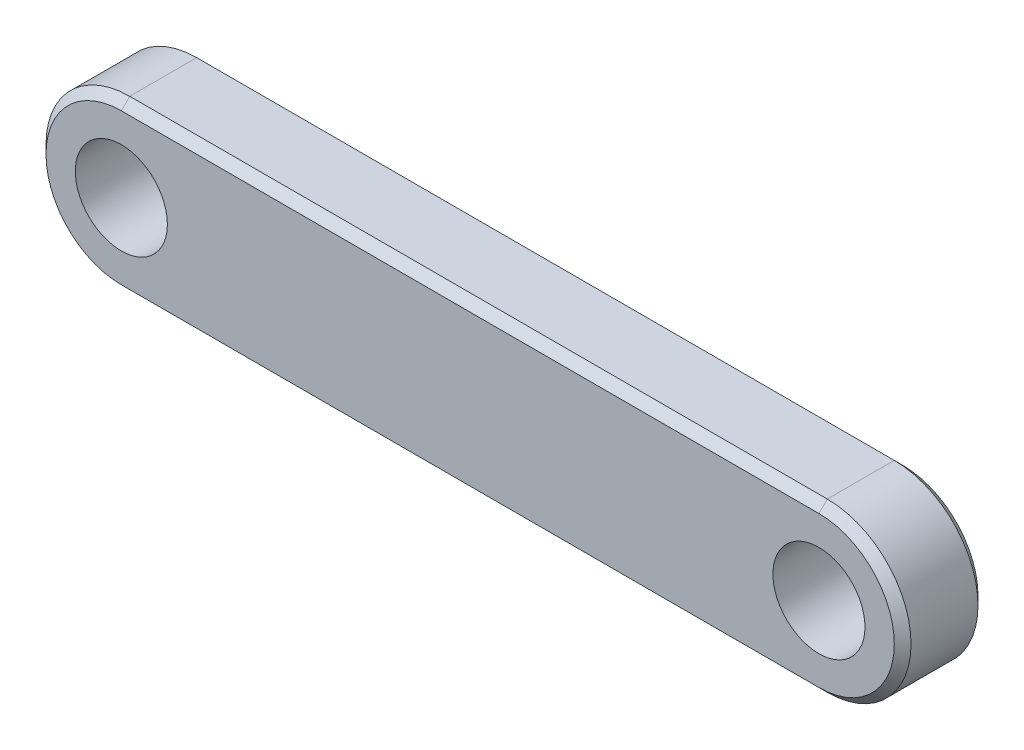
ISO-10303-21;
HEADER;
FILE_DESCRIPTION(('STEP AP214'),'2;1');
FILE_NAME('part.step','',(''),(''),'','','');
FILE_SCHEMA(('AUTOMOTIVE_DESIGN { 1 0 10303 214 1 1 1 1 }'));
ENDSEC;
DATA;
#1=APPLICATION_CONTEXT('core data for automotive mechanical design processes');
#2=APPLICATION_PROTOCOL_DEFINITION('international standard','automotive_design',2000,#1);
#3=PRODUCT_CONTEXT('',#1,'mechanical');
#4=PRODUCT('Part','Part','',(#3));
#5=PRODUCT_RELATED_PRODUCT_CATEGORY('part','',(#4));
#6=PRODUCT_DEFINITION_FORMATION('','',#4);
#7=PRODUCT_DEFINITION_CONTEXT('part definition',#1,'design');
#8=PRODUCT_DEFINITION('design','',#6,#7);
#9=PRODUCT_DEFINITION_SHAPE('','',#8);
#10=(LENGTH_UNIT() NAMED_UNIT(*) SI_UNIT(.MILLI.,.METRE.));
#11=(NAMED_UNIT(*) PLANE_ANGLE_UNIT() SI_UNIT($,.RADIAN.));
#12=(NAMED_UNIT(*) SI_UNIT($,.STERADIAN.) SOLID_ANGLE_UNIT());
#13=UNCERTAINTY_MEASURE_WITH_UNIT(LENGTH_MEASURE(1.E-05),#10,'distance_accuracy_value','');
#14=(GEOMETRIC_REPRESENTATION_CONTEXT(3) GLOBAL_UNCERTAINTY_ASSIGNED_CONTEXT((#13)) GLOBAL_UNIT_ASSIGNED_CONTEXT((#10,
#11,#12)) REPRESENTATION_CONTEXT('',''));
#15=CARTESIAN_POINT('',(0.,0.,0.));
#16=DIRECTION('',(0.,0.,1.));
#17=DIRECTION('',(1.,0.,0.));
#18=AXIS2_PLACEMENT_3D('',#15,#16,#17);
#19=CARTESIAN_POINT('',(-12.5,0.,3.));
#20=DIRECTION('',(0.,0.,1.));
#21=DIRECTION('',(1.,0.,0.));
#22=AXIS2_PLACEMENT_3D('',#19,#20,#21);
#23=PLANE('',#22);
#24=CARTESIAN_POINT('',(-12.5,0.,3.));
#25=DIRECTION('',(0.,0.,1.));
#26=DIRECTION('',(1.,0.,0.));
#27=AXIS2_PLACEMENT_3D('',#24,#25,#26);
#28=CIRCLE('',#27,2.7);
#29=CARTESIAN_POINT('',(-12.5,2.7,3.));
#30=VERTEX_POINT('',#29);
#31=CARTESIAN_POINT('',(-12.5,-2.7,3.));
#32=VERTEX_POINT('',#31);
#33=EDGE_CURVE('E169',#30,#32,#28,.T.);
#34=ORIENTED_EDGE('',*,*,#33,.T.);
#35=DIRECTION('',(1.,0.,0.));
#36=VECTOR('',#35,1.);
#37=CARTESIAN_POINT('',(12.5,-2.7,3.));
#38=LINE('',#37,#36);
#39=CARTESIAN_POINT('',(12.5,-2.7,3.));
#40=VERTEX_POINT('',#39);
#41=EDGE_CURVE('E164',#32,#40,#38,.T.);
#42=ORIENTED_EDGE('',*,*,#41,.T.);
#43=CARTESIAN_POINT('',(12.5,0.,3.));
#44=DIRECTION('',(0.,0.,1.));
#45=DIRECTION('',(1.,0.,0.));
#46=AXIS2_PLACEMENT_3D('',#43,#44,#45);
#47=CIRCLE('',#46,2.7);
#48=CARTESIAN_POINT('',(12.5,2.70000000000001,3.));
#49=VERTEX_POINT('',#48);
#50=EDGE_CURVE('E167',#40,#49,#47,.T.);
#51=ORIENTED_EDGE('',*,*,#50,.T.);
#52=DIRECTION('',(-1.,0.,0.));
#53=VECTOR('',#52,1.);
#54=CARTESIAN_POINT('',(-12.5,2.7,3.));
#55=LINE('',#54,#53);
#56=EDGE_CURVE('E171',#49,#30,#55,.T.);
#57=ORIENTED_EDGE('',*,*,#56,.T.);
#58=EDGE_LOOP('',(#34,#42,#51,#57));
#59=FACE_BOUND('',#58,.T.);
#60=CARTESIAN_POINT('',(-12.5,0.,3.));
#61=DIRECTION('',(0.,0.,1.));
#62=DIRECTION('',(1.,0.,0.));
#63=AXIS2_PLACEMENT_3D('',#60,#61,#62);
#64=CIRCLE('',#63,1.65);
#65=CARTESIAN_POINT('',(-10.85,0.,3.));
#66=VERTEX_POINT('',#65);
#67=EDGE_CURVE('E196',#66,#66,#64,.T.);
#68=ORIENTED_EDGE('',*,*,#67,.F.);
#69=EDGE_LOOP('',(#68));
#70=FACE_BOUND('',#69,.T.);
#71=CARTESIAN_POINT('',(12.5,0.,3.));
#72=DIRECTION('',(0.,0.,1.));
#73=DIRECTION('',(1.,0.,0.));
#74=AXIS2_PLACEMENT_3D('',#71,#72,#73);
#75=CIRCLE('',#74,1.65);
#76=CARTESIAN_POINT('',(14.15,0.,3.));
#77=VERTEX_POINT('',#76);
#78=EDGE_CURVE('E146',#77,#77,#75,.T.);
#79=ORIENTED_EDGE('',*,*,#78,.F.);
#80=EDGE_LOOP('',(#79));
#81=FACE_BOUND('',#80,.T.);
#82=ADVANCED_FACE('F43',(#59,#70,#81),#23,.T.);
#83=CARTESIAN_POINT('',(-12.5,0.,0.));
#84=DIRECTION('',(0.,0.,1.));
#85=DIRECTION('',(1.,0.,0.));
#86=AXIS2_PLACEMENT_3D('',#83,#84,#85);
#87=PLANE('',#86);
#88=CARTESIAN_POINT('',(12.5,0.,0.));
#89=DIRECTION('',(0.,0.,1.));
#90=DIRECTION('',(1.,0.,0.));
#91=AXIS2_PLACEMENT_3D('',#88,#89,#90);
#92=CIRCLE('',#91,1.95);
#93=CARTESIAN_POINT('',(14.45,0.,0.));
#94=VERTEX_POINT('',#93);
#95=EDGE_CURVE('E179',#94,#94,#92,.T.);
#96=ORIENTED_EDGE('',*,*,#95,.T.);
#97=EDGE_LOOP('',(#96));
#98=FACE_BOUND('',#97,.T.);
#99=CARTESIAN_POINT('',(-12.5,0.,0.));
#100=DIRECTION('',(0.,0.,1.));
#101=DIRECTION('',(1.,0.,0.));
#102=AXIS2_PLACEMENT_3D('',#99,#100,#101);
#103=CIRCLE('',#102,1.95);
#104=CARTESIAN_POINT('',(-10.55,0.,0.));
#105=VERTEX_POINT('',#104);
#106=EDGE_CURVE('E182',#105,#105,#103,.T.);
#107=ORIENTED_EDGE('',*,*,#106,.T.);
#108=EDGE_LOOP('',(#107));
#109=FACE_BOUND('',#108,.T.);
#110=CARTESIAN_POINT('',(12.5,0.,0.));
#111=DIRECTION('',(0.,0.,1.));
#112=DIRECTION('',(1.,0.,0.));
#113=AXIS2_PLACEMENT_3D('',#110,#111,#112);
#114=CIRCLE('',#113,2.70000000000001);
#115=CARTESIAN_POINT('',(12.5,2.70000000000001,0.));
#116=VERTEX_POINT('',#115);
#117=CARTESIAN_POINT('',(12.5,-2.7,0.));
#118=VERTEX_POINT('',#117);
#119=EDGE_CURVE('E121',#116,#118,#114,.F.);
#120=ORIENTED_EDGE('',*,*,#119,.T.);
#121=DIRECTION('',(-1.,0.,0.));
#122=VECTOR('',#121,1.);
#123=CARTESIAN_POINT('',(-12.5,-2.70000000000001,0.));
#124=LINE('',#123,#122);
#125=CARTESIAN_POINT('',(-12.5,-2.70000000000001,0.));
#126=VERTEX_POINT('',#125);
#127=EDGE_CURVE('E117',#118,#126,#124,.T.);
#128=ORIENTED_EDGE('',*,*,#127,.T.);
#129=CARTESIAN_POINT('',(-12.5,0.,0.));
#130=DIRECTION('',(0.,0.,1.));
#131=DIRECTION('',(1.,0.,0.));
#132=AXIS2_PLACEMENT_3D('',#129,#130,#131);
#133=CIRCLE('',#132,2.70000000000001);
#134=CARTESIAN_POINT('',(-12.5,2.70000000000001,0.));
#135=VERTEX_POINT('',#134);
#136=EDGE_CURVE('E111',#126,#135,#133,.F.);
#137=ORIENTED_EDGE('',*,*,#136,.T.);
#138=DIRECTION('',(1.,0.,0.));
#139=VECTOR('',#138,1.);
#140=CARTESIAN_POINT('',(-12.5,2.70000000000001,0.));
#141=LINE('',#140,#139);
#142=EDGE_CURVE('E114',#135,#116,#141,.T.);
#143=ORIENTED_EDGE('',*,*,#142,.T.);
#144=EDGE_LOOP('',(#120,#128,#137,#143));
#145=FACE_BOUND('',#144,.T.);
#146=ADVANCED_FACE('F113',(#98,#109,#145),#87,.F.);
#147=CARTESIAN_POINT('',(-12.5,0.,3.));
#148=DIRECTION('',(0.,0.,-1.));
#149=DIRECTION('',(-1.,0.,0.));
#150=AXIS2_PLACEMENT_3D('',#147,#148,#149);
#151=CYLINDRICAL_SURFACE('',#150,3.00000000000001);
#152=DIRECTION('',(0.,0.,-1.));
#153=VECTOR('',#152,1.);
#154=CARTESIAN_POINT('',(-12.5,-3.00000000000001,3.));
#155=LINE('',#154,#153);
#156=CARTESIAN_POINT('',(-12.5,-3.00000000000001,2.7));
#157=VERTEX_POINT('',#156);
#158=CARTESIAN_POINT('',(-12.5,-3.00000000000001,0.299999999999998));
#159=VERTEX_POINT('',#158);
#160=EDGE_CURVE('E129',#157,#159,#155,.T.);
#161=ORIENTED_EDGE('',*,*,#160,.F.);
#162=CARTESIAN_POINT('',(-12.5,0.,2.7));
#163=DIRECTION('',(0.,0.,1.));
#164=DIRECTION('',(1.,0.,0.));
#165=AXIS2_PLACEMENT_3D('',#162,#163,#164);
#166=CIRCLE('',#165,3.00000000000001);
#167=CARTESIAN_POINT('',(-12.5,3.00000000000001,2.7));
#168=VERTEX_POINT('',#167);
#169=EDGE_CURVE('E67',#157,#168,#166,.F.);
#170=ORIENTED_EDGE('',*,*,#169,.T.);
#171=DIRECTION('',(0.,0.,-1.));
#172=VECTOR('',#171,1.);
#173=CARTESIAN_POINT('',(-12.5,3.00000000000001,3.));
#174=LINE('',#173,#172);
#175=CARTESIAN_POINT('',(-12.5,3.00000000000001,0.299999999999998));
#176=VERTEX_POINT('',#175);
#177=EDGE_CURVE('E194',#168,#176,#174,.T.);
#178=ORIENTED_EDGE('',*,*,#177,.T.);
#179=CARTESIAN_POINT('',(-12.5,0.,0.299999999999998));
#180=DIRECTION('',(0.,0.,1.));
#181=DIRECTION('',(1.,0.,0.));
#182=AXIS2_PLACEMENT_3D('',#179,#180,#181);
#183=CIRCLE('',#182,3.00000000000001);
#184=EDGE_CURVE('E132',#176,#159,#183,.T.);
#185=ORIENTED_EDGE('',*,*,#184,.T.);
#186=EDGE_LOOP('',(#161,#170,#178,#185));
#187=FACE_BOUND('',#186,.T.);
#188=ADVANCED_FACE('F210',(#187),#151,.T.);
#189=CARTESIAN_POINT('',(-12.5,-3.00000000000001,3.));
#190=DIRECTION('',(0.,1.,0.));
#191=DIRECTION('',(-1.,0.,0.));
#192=AXIS2_PLACEMENT_3D('',#189,#190,#191);
#193=PLANE('',#192);
#194=DIRECTION('',(0.,0.,-1.));
#195=VECTOR('',#194,1.);
#196=CARTESIAN_POINT('',(12.5,-3.,3.));
#197=LINE('',#196,#195);
#198=CARTESIAN_POINT('',(12.5,-3.,2.7));
#199=VERTEX_POINT('',#198);
#200=CARTESIAN_POINT('',(12.5,-3.,0.299999999999998));
#201=VERTEX_POINT('',#200);
#202=EDGE_CURVE('E189',#199,#201,#197,.T.);
#203=ORIENTED_EDGE('',*,*,#202,.F.);
#204=DIRECTION('',(-1.,0.,0.));
#205=VECTOR('',#204,1.);
#206=CARTESIAN_POINT('',(-12.5,-3.00000000000001,2.7));
#207=LINE('',#206,#205);
#208=EDGE_CURVE('E158',#199,#157,#207,.T.);
#209=ORIENTED_EDGE('',*,*,#208,.T.);
#210=ORIENTED_EDGE('',*,*,#160,.T.);
#211=DIRECTION('',(1.,0.,0.));
#212=VECTOR('',#211,1.);
#213=CARTESIAN_POINT('',(-12.5,-3.00000000000001,0.299999999999998));
#214=LINE('',#213,#212);
#215=EDGE_CURVE('E161',#159,#201,#214,.T.);
#216=ORIENTED_EDGE('',*,*,#215,.T.);
#217=EDGE_LOOP('',(#203,#209,#210,#216));
#218=FACE_BOUND('',#217,.T.);
#219=ADVANCED_FACE('F224',(#218),#193,.F.);
#220=CARTESIAN_POINT('',(12.5,0.,3.));
#221=DIRECTION('',(0.,0.,-1.));
#222=DIRECTION('',(-1.,0.,0.));
#223=AXIS2_PLACEMENT_3D('',#220,#221,#222);
#224=CYLINDRICAL_SURFACE('',#223,3.00000000000001);
#225=DIRECTION('',(0.,0.,-1.));
#226=VECTOR('',#225,1.);
#227=CARTESIAN_POINT('',(12.5,3.00000000000001,3.));
#228=LINE('',#227,#226);
#229=CARTESIAN_POINT('',(12.5,3.00000000000001,2.7));
#230=VERTEX_POINT('',#229);
#231=CARTESIAN_POINT('',(12.5,3.00000000000001,0.299999999999998));
#232=VERTEX_POINT('',#231);
#233=EDGE_CURVE('E192',#230,#232,#228,.T.);
#234=ORIENTED_EDGE('',*,*,#233,.F.);
#235=CARTESIAN_POINT('',(12.5,0.,2.7));
#236=DIRECTION('',(0.,0.,1.));
#237=DIRECTION('',(1.,0.,0.));
#238=AXIS2_PLACEMENT_3D('',#235,#236,#237);
#239=CIRCLE('',#238,3.00000000000001);
#240=EDGE_CURVE('E154',#230,#199,#239,.F.);
#241=ORIENTED_EDGE('',*,*,#240,.T.);
#242=ORIENTED_EDGE('',*,*,#202,.T.);
#243=CARTESIAN_POINT('',(12.5,0.,0.299999999999998));
#244=DIRECTION('',(0.,0.,1.));
#245=DIRECTION('',(1.,0.,0.));
#246=AXIS2_PLACEMENT_3D('',#243,#244,#245);
#247=CIRCLE('',#246,3.00000000000001);
#248=EDGE_CURVE('E156',#201,#232,#247,.T.);
#249=ORIENTED_EDGE('',*,*,#248,.T.);
#250=EDGE_LOOP('',(#234,#241,#242,#249));
#251=FACE_BOUND('',#250,.T.);
#252=ADVANCED_FACE('F221',(#251),#224,.T.);
#253=CARTESIAN_POINT('',(-12.5,3.00000000000001,3.));
#254=DIRECTION('',(0.,-1.,0.));
#255=DIRECTION('',(1.,0.,0.));
#256=AXIS2_PLACEMENT_3D('',#253,#254,#255);
#257=PLANE('',#256);
#258=ORIENTED_EDGE('',*,*,#177,.F.);
#259=DIRECTION('',(1.,0.,0.));
#260=VECTOR('',#259,1.);
#261=CARTESIAN_POINT('',(12.5,3.00000000000001,2.7));
#262=LINE('',#261,#260);
#263=EDGE_CURVE('E11',#168,#230,#262,.T.);
#264=ORIENTED_EDGE('',*,*,#263,.T.);
#265=ORIENTED_EDGE('',*,*,#233,.T.);
#266=DIRECTION('',(-1.,0.,0.));
#267=VECTOR('',#266,1.);
#268=CARTESIAN_POINT('',(-12.5,3.00000000000001,0.299999999999998));
#269=LINE('',#268,#267);
#270=EDGE_CURVE('E53',#232,#176,#269,.T.);
#271=ORIENTED_EDGE('',*,*,#270,.T.);
#272=EDGE_LOOP('',(#258,#264,#265,#271));
#273=FACE_BOUND('',#272,.T.);
#274=ADVANCED_FACE('F218',(#273),#257,.F.);
#275=CARTESIAN_POINT('',(-12.5,0.,3.));
#276=DIRECTION('',(0.,0.,-1.));
#277=DIRECTION('',(-1.,0.,0.));
#278=AXIS2_PLACEMENT_3D('',#275,#276,#277);
#279=CYLINDRICAL_SURFACE('',#278,1.65);
#280=CARTESIAN_POINT('',(-12.5,0.,0.300000000000003));
#281=DIRECTION('',(0.,0.,1.));
#282=DIRECTION('',(1.,0.,0.));
#283=AXIS2_PLACEMENT_3D('',#280,#281,#282);
#284=CIRCLE('',#283,1.65);
#285=CARTESIAN_POINT('',(-10.85,0.,0.300000000000003));
#286=VERTEX_POINT('',#285);
#287=EDGE_CURVE('E173',#286,#286,#284,.F.);
#288=ORIENTED_EDGE('',*,*,#287,.T.);
#289=EDGE_LOOP('',(#288));
#290=FACE_BOUND('',#289,.T.);
#291=ORIENTED_EDGE('',*,*,#67,.T.);
#292=EDGE_LOOP('',(#291));
#293=FACE_BOUND('',#292,.T.);
#294=ADVANCED_FACE('F215',(#290,#293),#279,.F.);
#295=CARTESIAN_POINT('',(12.5,0.,3.));
#296=DIRECTION('',(0.,0.,-1.));
#297=DIRECTION('',(-1.,0.,0.));
#298=AXIS2_PLACEMENT_3D('',#295,#296,#297);
#299=CYLINDRICAL_SURFACE('',#298,1.65);
#300=CARTESIAN_POINT('',(12.5,0.,0.300000000000003));
#301=DIRECTION('',(0.,0.,1.));
#302=DIRECTION('',(1.,0.,0.));
#303=AXIS2_PLACEMENT_3D('',#300,#301,#302);
#304=CIRCLE('',#303,1.65);
#305=CARTESIAN_POINT('',(14.15,0.,0.300000000000003));
#306=VERTEX_POINT('',#305);
#307=EDGE_CURVE('E176',#306,#306,#304,.F.);
#308=ORIENTED_EDGE('',*,*,#307,.T.);
#309=EDGE_LOOP('',(#308));
#310=FACE_BOUND('',#309,.T.);
#311=ORIENTED_EDGE('',*,*,#78,.T.);
#312=EDGE_LOOP('',(#311));
#313=FACE_BOUND('',#312,.T.);
#314=ADVANCED_FACE('F202',(#310,#313),#299,.F.);
#315=CARTESIAN_POINT('',(12.5,0.,0.));
#316=DIRECTION('',(0.,0.,-1.));
#317=DIRECTION('',(-1.,0.,0.));
#318=AXIS2_PLACEMENT_3D('',#315,#316,#317);
#319=CONICAL_SURFACE('',#318,1.95,0.785398163397442);
#320=ORIENTED_EDGE('',*,*,#307,.F.);
#321=EDGE_LOOP('',(#320));
#322=FACE_BOUND('',#321,.T.);
#323=ORIENTED_EDGE('',*,*,#95,.F.);
#324=EDGE_LOOP('',(#323));
#325=FACE_BOUND('',#324,.T.);
#326=ADVANCED_FACE('F232',(#322,#325),#319,.F.);
#327=CARTESIAN_POINT('',(-12.5,0.,0.));
#328=DIRECTION('',(0.,0.,-1.));
#329=DIRECTION('',(-1.,0.,0.));
#330=AXIS2_PLACEMENT_3D('',#327,#328,#329);
#331=CONICAL_SURFACE('',#330,1.95,0.785398163397442);
#332=ORIENTED_EDGE('',*,*,#287,.F.);
#333=EDGE_LOOP('',(#332));
#334=FACE_BOUND('',#333,.T.);
#335=ORIENTED_EDGE('',*,*,#106,.F.);
#336=EDGE_LOOP('',(#335));
#337=FACE_BOUND('',#336,.T.);
#338=ADVANCED_FACE('F238',(#334,#337),#331,.F.);
#339=CARTESIAN_POINT('',(-12.5,2.7,3.));
#340=DIRECTION('',(0.,0.707106781186548,0.707106781186548));
#341=DIRECTION('',(1.,0.,0.));
#342=AXIS2_PLACEMENT_3D('',#339,#340,#341);
#343=PLANE('',#342);
#344=DIRECTION('',(0.,-0.707106781186548,0.707106781186548));
#345=VECTOR('',#344,1.);
#346=CARTESIAN_POINT('',(12.5,3.00000000000001,2.7));
#347=LINE('',#346,#345);
#348=EDGE_CURVE('E147',#230,#49,#347,.T.);
#349=ORIENTED_EDGE('',*,*,#348,.F.);
#350=ORIENTED_EDGE('',*,*,#263,.F.);
#351=DIRECTION('',(0.,0.707106781186548,-0.707106781186548));
#352=VECTOR('',#351,1.);
#353=CARTESIAN_POINT('',(-12.5,2.7,3.));
#354=LINE('',#353,#352);
#355=EDGE_CURVE('E143',#30,#168,#354,.T.);
#356=ORIENTED_EDGE('',*,*,#355,.F.);
#357=ORIENTED_EDGE('',*,*,#56,.F.);
#358=EDGE_LOOP('',(#349,#350,#356,#357));
#359=FACE_BOUND('',#358,.T.);
#360=ADVANCED_FACE('F245',(#359),#343,.T.);
#361=CARTESIAN_POINT('',(-12.5,0.,3.));
#362=DIRECTION('',(0.,0.,-1.));
#363=DIRECTION('',(-1.,0.,0.));
#364=AXIS2_PLACEMENT_3D('',#361,#362,#363);
#365=CONICAL_SURFACE('',#364,2.7,0.785398163397448);
#366=ORIENTED_EDGE('',*,*,#355,.T.);
#367=ORIENTED_EDGE('',*,*,#169,.F.);
#368=DIRECTION('',(0.,-0.707106781186548,-0.707106781186548));
#369=VECTOR('',#368,1.);
#370=CARTESIAN_POINT('',(-12.5,-2.7,3.));
#371=LINE('',#370,#369);
#372=EDGE_CURVE('E134',#32,#157,#371,.T.);
#373=ORIENTED_EDGE('',*,*,#372,.F.);
#374=ORIENTED_EDGE('',*,*,#33,.F.);
#375=EDGE_LOOP('',(#366,#367,#373,#374));
#376=FACE_BOUND('',#375,.T.);
#377=ADVANCED_FACE('F261',(#376),#365,.T.);
#378=CARTESIAN_POINT('',(12.5,0.,3.));
#379=DIRECTION('',(0.,0.,-1.));
#380=DIRECTION('',(-1.,0.,0.));
#381=AXIS2_PLACEMENT_3D('',#378,#379,#380);
#382=CONICAL_SURFACE('',#381,2.7,0.785398163397448);
#383=ORIENTED_EDGE('',*,*,#348,.T.);
#384=ORIENTED_EDGE('',*,*,#50,.F.);
#385=DIRECTION('',(0.,0.707106781186548,0.707106781186548));
#386=VECTOR('',#385,1.);
#387=CARTESIAN_POINT('',(12.5,-3.,2.7));
#388=LINE('',#387,#386);
#389=EDGE_CURVE('E133',#199,#40,#388,.T.);
#390=ORIENTED_EDGE('',*,*,#389,.F.);
#391=ORIENTED_EDGE('',*,*,#240,.F.);
#392=EDGE_LOOP('',(#383,#384,#390,#391));
#393=FACE_BOUND('',#392,.T.);
#394=ADVANCED_FACE('F254',(#393),#382,.T.);
#395=CARTESIAN_POINT('',(-12.5,-2.7,3.));
#396=DIRECTION('',(0.,-0.707106781186548,0.707106781186548));
#397=DIRECTION('',(-1.,0.,0.));
#398=AXIS2_PLACEMENT_3D('',#395,#396,#397);
#399=PLANE('',#398);
#400=ORIENTED_EDGE('',*,*,#372,.T.);
#401=ORIENTED_EDGE('',*,*,#208,.F.);
#402=ORIENTED_EDGE('',*,*,#389,.T.);
#403=ORIENTED_EDGE('',*,*,#41,.F.);
#404=EDGE_LOOP('',(#400,#401,#402,#403));
#405=FACE_BOUND('',#404,.T.);
#406=ADVANCED_FACE('F248',(#405),#399,.T.);
#407=CARTESIAN_POINT('',(-12.5,3.00000000000001,0.299999999999998));
#408=DIRECTION('',(0.,-0.707106781186547,0.707106781186547));
#409=DIRECTION('',(-1.,0.,0.));
#410=AXIS2_PLACEMENT_3D('',#407,#408,#409);
#411=PLANE('',#410);
#412=DIRECTION('',(0.,0.707106781186547,0.707106781186547));
#413=VECTOR('',#412,1.);
#414=CARTESIAN_POINT('',(12.5,2.70000000000001,0.));
#415=LINE('',#414,#413);
#416=EDGE_CURVE('E127',#116,#232,#415,.T.);
#417=ORIENTED_EDGE('',*,*,#416,.F.);
#418=ORIENTED_EDGE('',*,*,#142,.F.);
#419=DIRECTION('',(0.,-0.707106781186547,-0.707106781186547));
#420=VECTOR('',#419,1.);
#421=CARTESIAN_POINT('',(-12.5,3.00000000000001,0.299999999999998));
#422=LINE('',#421,#420);
#423=EDGE_CURVE('E48',#176,#135,#422,.T.);
#424=ORIENTED_EDGE('',*,*,#423,.F.);
#425=ORIENTED_EDGE('',*,*,#270,.F.);
#426=EDGE_LOOP('',(#417,#418,#424,#425));
#427=FACE_BOUND('',#426,.T.);
#428=ADVANCED_FACE('F46',(#427),#411,.F.);
#429=CARTESIAN_POINT('',(-12.5,0.,0.299999999999998));
#430=DIRECTION('',(0.,0.,1.));
#431=DIRECTION('',(1.,0.,0.));
#432=AXIS2_PLACEMENT_3D('',#429,#430,#431);
#433=CONICAL_SURFACE('',#432,3.00000000000001,0.785398163397448);
#434=ORIENTED_EDGE('',*,*,#423,.T.);
#435=ORIENTED_EDGE('',*,*,#136,.F.);
#436=DIRECTION('',(0.,0.707106781186547,-0.707106781186547));
#437=VECTOR('',#436,1.);
#438=CARTESIAN_POINT('',(-12.5,-3.00000000000001,0.299999999999998));
#439=LINE('',#438,#437);
#440=EDGE_CURVE('E136',#159,#126,#439,.T.);
#441=ORIENTED_EDGE('',*,*,#440,.F.);
#442=ORIENTED_EDGE('',*,*,#184,.F.);
#443=EDGE_LOOP('',(#434,#435,#441,#442));
#444=FACE_BOUND('',#443,.T.);
#445=ADVANCED_FACE('F131',(#444),#433,.T.);
#446=CARTESIAN_POINT('',(12.5,0.,0.299999999999998));
#447=DIRECTION('',(0.,0.,1.));
#448=DIRECTION('',(1.,0.,0.));
#449=AXIS2_PLACEMENT_3D('',#446,#447,#448);
#450=CONICAL_SURFACE('',#449,3.00000000000001,0.785398163397448);
#451=ORIENTED_EDGE('',*,*,#416,.T.);
#452=ORIENTED_EDGE('',*,*,#248,.F.);
#453=DIRECTION('',(0.,-0.707106781186547,0.707106781186547));
#454=VECTOR('',#453,1.);
#455=CARTESIAN_POINT('',(12.5,-2.7,0.));
#456=LINE('',#455,#454);
#457=EDGE_CURVE('E139',#118,#201,#456,.T.);
#458=ORIENTED_EDGE('',*,*,#457,.F.);
#459=ORIENTED_EDGE('',*,*,#119,.F.);
#460=EDGE_LOOP('',(#451,#452,#458,#459));
#461=FACE_BOUND('',#460,.T.);
#462=ADVANCED_FACE('F280',(#461),#450,.T.);
#463=CARTESIAN_POINT('',(-12.5,-3.00000000000001,0.299999999999998));
#464=DIRECTION('',(0.,0.707106781186547,0.707106781186547));
#465=DIRECTION('',(1.,0.,0.));
#466=AXIS2_PLACEMENT_3D('',#463,#464,#465);
#467=PLANE('',#466);
#468=ORIENTED_EDGE('',*,*,#440,.T.);
#469=ORIENTED_EDGE('',*,*,#127,.F.);
#470=ORIENTED_EDGE('',*,*,#457,.T.);
#471=ORIENTED_EDGE('',*,*,#215,.F.);
#472=EDGE_LOOP('',(#468,#469,#470,#471));
#473=FACE_BOUND('',#472,.T.);
#474=ADVANCED_FACE('F274',(#473),#467,.F.);
#475=CLOSED_SHELL('',(#82,#146,#188,#219,#252,#274,#294,#314,#326,#338,#360,#377,#394,#406,#428,
#445,#462,#474));
#476=MANIFOLD_SOLID_BREP('B2',#475);
#477=ADVANCED_BREP_SHAPE_REPRESENTATION('',(#18,#476),#14);
#478=SHAPE_DEFINITION_REPRESENTATION(#9,#477);
ENDSEC;
END-ISO-10303-21;
